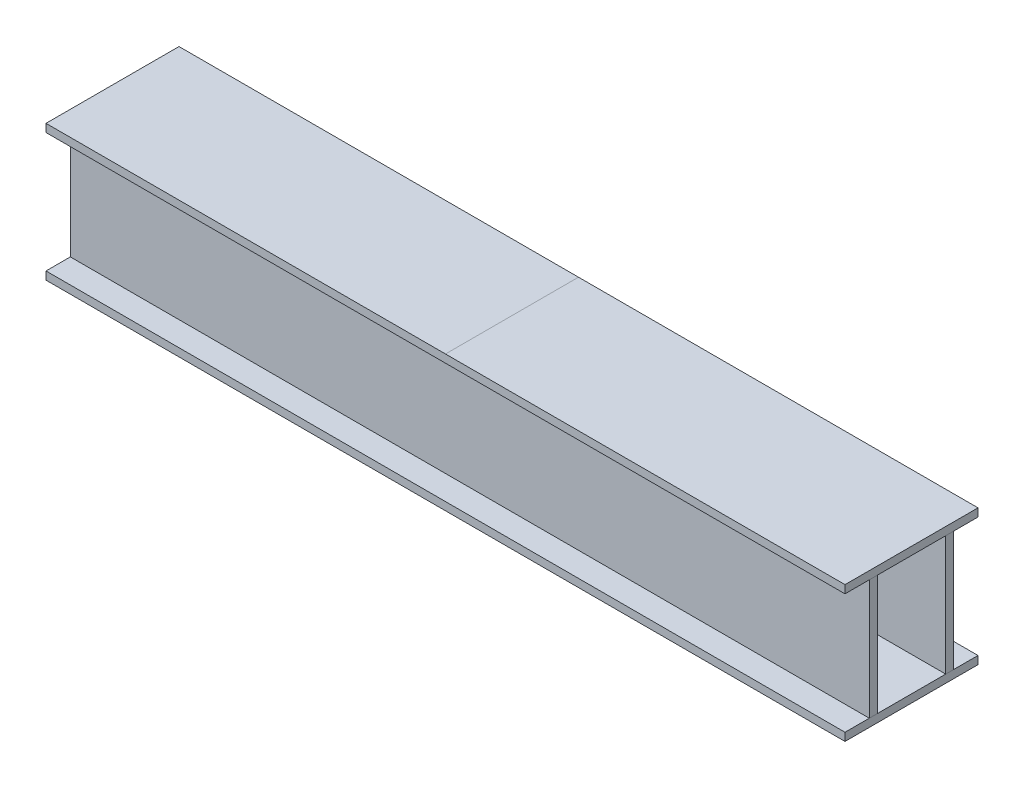
ISO-10303-21;
HEADER;
FILE_DESCRIPTION(('STEP AP214'),'2;1');
FILE_NAME('part.step','',(''),(''),'','','');
FILE_SCHEMA(('AUTOMOTIVE_DESIGN { 1 0 10303 214 1 1 1 1 }'));
ENDSEC;
DATA;
#1=APPLICATION_CONTEXT('core data for automotive mechanical design processes');
#2=APPLICATION_PROTOCOL_DEFINITION('international standard','automotive_design',2000,#1);
#3=PRODUCT_CONTEXT('',#1,'mechanical');
#4=PRODUCT('Part','Part','',(#3));
#5=PRODUCT_RELATED_PRODUCT_CATEGORY('part','',(#4));
#6=PRODUCT_DEFINITION_FORMATION('','',#4);
#7=PRODUCT_DEFINITION_CONTEXT('part definition',#1,'design');
#8=PRODUCT_DEFINITION('design','',#6,#7);
#9=PRODUCT_DEFINITION_SHAPE('','',#8);
#10=(LENGTH_UNIT() NAMED_UNIT(*) SI_UNIT(.MILLI.,.METRE.));
#11=(NAMED_UNIT(*) PLANE_ANGLE_UNIT() SI_UNIT($,.RADIAN.));
#12=(NAMED_UNIT(*) SI_UNIT($,.STERADIAN.) SOLID_ANGLE_UNIT());
#13=UNCERTAINTY_MEASURE_WITH_UNIT(LENGTH_MEASURE(1.E-05),#10,'distance_accuracy_value','');
#14=(GEOMETRIC_REPRESENTATION_CONTEXT(3) GLOBAL_UNCERTAINTY_ASSIGNED_CONTEXT((#13)) GLOBAL_UNIT_ASSIGNED_CONTEXT((#10,
#11,#12)) REPRESENTATION_CONTEXT('',''));
#15=CARTESIAN_POINT('',(0.,0.,0.));
#16=DIRECTION('',(0.,0.,1.));
#17=DIRECTION('',(1.,0.,0.));
#18=AXIS2_PLACEMENT_3D('',#15,#16,#17);
#19=CARTESIAN_POINT('',(500.,-75.,0.));
#20=DIRECTION('',(0.,1.,0.));
#21=DIRECTION('',(0.,0.,1.));
#22=AXIS2_PLACEMENT_3D('',#19,#20,#21);
#23=PLANE('',#22);
#24=DIRECTION('',(0.,0.,-1.));
#25=VECTOR('',#24,1.);
#26=CARTESIAN_POINT('',(-500.,-75.,0.));
#27=LINE('',#26,#25);
#28=CARTESIAN_POINT('',(-500.,-75.,-42.7975000000002));
#29=VERTEX_POINT('',#28);
#30=CARTESIAN_POINT('',(-500.,-75.,-52.7975));
#31=VERTEX_POINT('',#30);
#32=EDGE_CURVE('E119',#29,#31,#27,.T.);
#33=ORIENTED_EDGE('',*,*,#32,.T.);
#34=DIRECTION('',(-1.,0.,0.));
#35=VECTOR('',#34,1.);
#36=CARTESIAN_POINT('',(500.,-75.,-52.7975));
#37=LINE('',#36,#35);
#38=CARTESIAN_POINT('',(500.,-75.,-52.7975));
#39=VERTEX_POINT('',#38);
#40=EDGE_CURVE('E12',#39,#31,#37,.T.);
#41=ORIENTED_EDGE('',*,*,#40,.F.);
#42=DIRECTION('',(0.,0.,-1.));
#43=VECTOR('',#42,1.);
#44=CARTESIAN_POINT('',(500.,-75.,0.));
#45=LINE('',#44,#43);
#46=CARTESIAN_POINT('',(500.,-75.,-42.7975000000002));
#47=VERTEX_POINT('',#46);
#48=EDGE_CURVE('E105',#47,#39,#45,.T.);
#49=ORIENTED_EDGE('',*,*,#48,.F.);
#50=DIRECTION('',(-1.,0.,0.));
#51=VECTOR('',#50,1.);
#52=CARTESIAN_POINT('',(500.,-75.,-42.7975000000002));
#53=LINE('',#52,#51);
#54=EDGE_CURVE('E72',#47,#29,#53,.T.);
#55=ORIENTED_EDGE('',*,*,#54,.T.);
#56=EDGE_LOOP('',(#33,#41,#49,#55));
#57=FACE_BOUND('',#56,.T.);
#58=ADVANCED_FACE('F56',(#57),#23,.F.);
#59=CARTESIAN_POINT('',(500.,0.,-52.7975));
#60=DIRECTION('',(0.,0.,1.));
#61=DIRECTION('',(1.,0.,0.));
#62=AXIS2_PLACEMENT_3D('',#59,#60,#61);
#63=PLANE('',#62);
#64=DIRECTION('',(0.,1.,0.));
#65=VECTOR('',#64,1.);
#66=CARTESIAN_POINT('',(-500.,0.,-52.7975));
#67=LINE('',#66,#65);
#68=CARTESIAN_POINT('',(-500.,75.,-52.7975));
#69=VERTEX_POINT('',#68);
#70=EDGE_CURVE('E110',#31,#69,#67,.T.);
#71=ORIENTED_EDGE('',*,*,#70,.T.);
#72=DIRECTION('',(-1.,0.,0.));
#73=VECTOR('',#72,1.);
#74=CARTESIAN_POINT('',(500.,75.,-52.7975));
#75=LINE('',#74,#73);
#76=CARTESIAN_POINT('',(500.,75.,-52.7975));
#77=VERTEX_POINT('',#76);
#78=EDGE_CURVE('E64',#77,#69,#75,.T.);
#79=ORIENTED_EDGE('',*,*,#78,.F.);
#80=DIRECTION('',(0.,1.,0.));
#81=VECTOR('',#80,1.);
#82=CARTESIAN_POINT('',(500.,0.,-52.7975));
#83=LINE('',#82,#81);
#84=EDGE_CURVE('E97',#39,#77,#83,.T.);
#85=ORIENTED_EDGE('',*,*,#84,.F.);
#86=ORIENTED_EDGE('',*,*,#40,.T.);
#87=EDGE_LOOP('',(#71,#79,#85,#86));
#88=FACE_BOUND('',#87,.T.);
#89=ADVANCED_FACE('F109',(#88),#63,.F.);
#90=CARTESIAN_POINT('',(500.,75.,0.));
#91=DIRECTION('',(0.,1.,0.));
#92=DIRECTION('',(0.,0.,1.));
#93=AXIS2_PLACEMENT_3D('',#90,#91,#92);
#94=PLANE('',#93);
#95=DIRECTION('',(0.,0.,-1.));
#96=VECTOR('',#95,1.);
#97=CARTESIAN_POINT('',(-500.,75.,0.));
#98=LINE('',#97,#96);
#99=CARTESIAN_POINT('',(-500.,75.,-42.7975000000002));
#100=VERTEX_POINT('',#99);
#101=EDGE_CURVE('E122',#100,#69,#98,.T.);
#102=ORIENTED_EDGE('',*,*,#101,.F.);
#103=DIRECTION('',(-1.,0.,0.));
#104=VECTOR('',#103,1.);
#105=CARTESIAN_POINT('',(500.,75.,-42.7975000000002));
#106=LINE('',#105,#104);
#107=CARTESIAN_POINT('',(500.,75.,-42.7975000000002));
#108=VERTEX_POINT('',#107);
#109=EDGE_CURVE('E86',#108,#100,#106,.T.);
#110=ORIENTED_EDGE('',*,*,#109,.F.);
#111=DIRECTION('',(0.,0.,-1.));
#112=VECTOR('',#111,1.);
#113=CARTESIAN_POINT('',(500.,75.,0.));
#114=LINE('',#113,#112);
#115=EDGE_CURVE('E104',#108,#77,#114,.T.);
#116=ORIENTED_EDGE('',*,*,#115,.T.);
#117=ORIENTED_EDGE('',*,*,#78,.T.);
#118=EDGE_LOOP('',(#102,#110,#116,#117));
#119=FACE_BOUND('',#118,.T.);
#120=ADVANCED_FACE('F113',(#119),#94,.T.);
#121=CARTESIAN_POINT('',(500.,0.,-42.7975000000002));
#122=DIRECTION('',(0.,0.,1.));
#123=DIRECTION('',(1.,0.,0.));
#124=AXIS2_PLACEMENT_3D('',#121,#122,#123);
#125=PLANE('',#124);
#126=DIRECTION('',(0.,1.,0.));
#127=VECTOR('',#126,1.);
#128=CARTESIAN_POINT('',(-500.,0.,-42.7975000000002));
#129=LINE('',#128,#127);
#130=EDGE_CURVE('E124',#29,#100,#129,.T.);
#131=ORIENTED_EDGE('',*,*,#130,.F.);
#132=ORIENTED_EDGE('',*,*,#54,.F.);
#133=DIRECTION('',(0.,1.,0.));
#134=VECTOR('',#133,1.);
#135=CARTESIAN_POINT('',(500.,0.,-42.7975000000002));
#136=LINE('',#135,#134);
#137=EDGE_CURVE('E114',#47,#108,#136,.T.);
#138=ORIENTED_EDGE('',*,*,#137,.T.);
#139=ORIENTED_EDGE('',*,*,#109,.T.);
#140=EDGE_LOOP('',(#131,#132,#138,#139));
#141=FACE_BOUND('',#140,.T.);
#142=ADVANCED_FACE('F130',(#141),#125,.T.);
#143=CARTESIAN_POINT('',(500.,0.,0.));
#144=DIRECTION('',(1.,0.,0.));
#145=DIRECTION('',(0.,0.,-1.));
#146=AXIS2_PLACEMENT_3D('',#143,#144,#145);
#147=PLANE('',#146);
#148=ORIENTED_EDGE('',*,*,#48,.T.);
#149=ORIENTED_EDGE('',*,*,#84,.T.);
#150=ORIENTED_EDGE('',*,*,#115,.F.);
#151=ORIENTED_EDGE('',*,*,#137,.F.);
#152=EDGE_LOOP('',(#148,#149,#150,#151));
#153=FACE_BOUND('',#152,.T.);
#154=ADVANCED_FACE('F101',(#153),#147,.T.);
#155=CARTESIAN_POINT('',(-500.,0.,0.));
#156=DIRECTION('',(1.,0.,0.));
#157=DIRECTION('',(0.,0.,-1.));
#158=AXIS2_PLACEMENT_3D('',#155,#156,#157);
#159=PLANE('',#158);
#160=ORIENTED_EDGE('',*,*,#32,.F.);
#161=ORIENTED_EDGE('',*,*,#130,.T.);
#162=ORIENTED_EDGE('',*,*,#101,.T.);
#163=ORIENTED_EDGE('',*,*,#70,.F.);
#164=EDGE_LOOP('',(#160,#161,#162,#163));
#165=FACE_BOUND('',#164,.T.);
#166=ADVANCED_FACE('F129',(#165),#159,.F.);
#167=CLOSED_SHELL('',(#58,#89,#120,#142,#154,#166));
#168=MANIFOLD_SOLID_BREP('B2',#167);
#169=CARTESIAN_POINT('',(500.,-75.0000000000001,1.0408340855861E-13));
#170=DIRECTION('',(0.,1.,0.));
#171=DIRECTION('',(0.,0.,1.));
#172=AXIS2_PLACEMENT_3D('',#169,#170,#171);
#173=PLANE('',#172);
#174=DIRECTION('',(0.,0.,-1.));
#175=VECTOR('',#174,1.);
#176=CARTESIAN_POINT('',(-500.,-75.0000000000001,1.0408340855861E-13));
#177=LINE('',#176,#175);
#178=CARTESIAN_POINT('',(-500.,-75.,52.7975));
#179=VERTEX_POINT('',#178);
#180=CARTESIAN_POINT('',(-500.,-75.,42.7975000000002));
#181=VERTEX_POINT('',#180);
#182=EDGE_CURVE('E259',#179,#181,#177,.T.);
#183=ORIENTED_EDGE('',*,*,#182,.T.);
#184=DIRECTION('',(-1.,0.,0.));
#185=VECTOR('',#184,1.);
#186=CARTESIAN_POINT('',(500.,-75.,42.7975000000002));
#187=LINE('',#186,#185);
#188=CARTESIAN_POINT('',(500.,-75.,42.7975000000002));
#189=VERTEX_POINT('',#188);
#190=EDGE_CURVE('E54',#189,#181,#187,.T.);
#191=ORIENTED_EDGE('',*,*,#190,.F.);
#192=DIRECTION('',(0.,0.,-1.));
#193=VECTOR('',#192,1.);
#194=CARTESIAN_POINT('',(500.,-75.0000000000001,1.0408340855861E-13));
#195=LINE('',#194,#193);
#196=CARTESIAN_POINT('',(500.,-75.,52.7975));
#197=VERTEX_POINT('',#196);
#198=EDGE_CURVE('E245',#197,#189,#195,.T.);
#199=ORIENTED_EDGE('',*,*,#198,.F.);
#200=DIRECTION('',(-1.,0.,0.));
#201=VECTOR('',#200,1.);
#202=CARTESIAN_POINT('',(500.,-75.,52.7975));
#203=LINE('',#202,#201);
#204=EDGE_CURVE('E212',#197,#179,#203,.T.);
#205=ORIENTED_EDGE('',*,*,#204,.T.);
#206=EDGE_LOOP('',(#183,#191,#199,#205));
#207=FACE_BOUND('',#206,.T.);
#208=ADVANCED_FACE('F196',(#207),#173,.F.);
#209=CARTESIAN_POINT('',(500.,0.,42.7975000000002));
#210=DIRECTION('',(0.,0.,1.));
#211=DIRECTION('',(1.,0.,0.));
#212=AXIS2_PLACEMENT_3D('',#209,#210,#211);
#213=PLANE('',#212);
#214=DIRECTION('',(0.,1.,0.));
#215=VECTOR('',#214,1.);
#216=CARTESIAN_POINT('',(-500.,0.,42.7975000000002));
#217=LINE('',#216,#215);
#218=CARTESIAN_POINT('',(-500.,75.,42.7975000000002));
#219=VERTEX_POINT('',#218);
#220=EDGE_CURVE('E250',#181,#219,#217,.T.);
#221=ORIENTED_EDGE('',*,*,#220,.T.);
#222=DIRECTION('',(-1.,0.,0.));
#223=VECTOR('',#222,1.);
#224=CARTESIAN_POINT('',(500.,75.,42.7975000000002));
#225=LINE('',#224,#223);
#226=CARTESIAN_POINT('',(500.,75.,42.7975000000002));
#227=VERTEX_POINT('',#226);
#228=EDGE_CURVE('E204',#227,#219,#225,.T.);
#229=ORIENTED_EDGE('',*,*,#228,.F.);
#230=DIRECTION('',(0.,1.,0.));
#231=VECTOR('',#230,1.);
#232=CARTESIAN_POINT('',(500.,0.,42.7975000000002));
#233=LINE('',#232,#231);
#234=EDGE_CURVE('E237',#189,#227,#233,.T.);
#235=ORIENTED_EDGE('',*,*,#234,.F.);
#236=ORIENTED_EDGE('',*,*,#190,.T.);
#237=EDGE_LOOP('',(#221,#229,#235,#236));
#238=FACE_BOUND('',#237,.T.);
#239=ADVANCED_FACE('F249',(#238),#213,.F.);
#240=CARTESIAN_POINT('',(500.,75.,0.));
#241=DIRECTION('',(0.,1.,0.));
#242=DIRECTION('',(0.,0.,1.));
#243=AXIS2_PLACEMENT_3D('',#240,#241,#242);
#244=PLANE('',#243);
#245=DIRECTION('',(0.,0.,-1.));
#246=VECTOR('',#245,1.);
#247=CARTESIAN_POINT('',(-500.,75.,0.));
#248=LINE('',#247,#246);
#249=CARTESIAN_POINT('',(-500.,75.,52.7975));
#250=VERTEX_POINT('',#249);
#251=EDGE_CURVE('E262',#250,#219,#248,.T.);
#252=ORIENTED_EDGE('',*,*,#251,.F.);
#253=DIRECTION('',(-1.,0.,0.));
#254=VECTOR('',#253,1.);
#255=CARTESIAN_POINT('',(500.,75.,52.7975));
#256=LINE('',#255,#254);
#257=CARTESIAN_POINT('',(500.,75.,52.7975));
#258=VERTEX_POINT('',#257);
#259=EDGE_CURVE('E226',#258,#250,#256,.T.);
#260=ORIENTED_EDGE('',*,*,#259,.F.);
#261=DIRECTION('',(0.,0.,-1.));
#262=VECTOR('',#261,1.);
#263=CARTESIAN_POINT('',(500.,75.,0.));
#264=LINE('',#263,#262);
#265=EDGE_CURVE('E244',#258,#227,#264,.T.);
#266=ORIENTED_EDGE('',*,*,#265,.T.);
#267=ORIENTED_EDGE('',*,*,#228,.T.);
#268=EDGE_LOOP('',(#252,#260,#266,#267));
#269=FACE_BOUND('',#268,.T.);
#270=ADVANCED_FACE('F253',(#269),#244,.T.);
#271=CARTESIAN_POINT('',(500.,0.,52.7975));
#272=DIRECTION('',(0.,0.,1.));
#273=DIRECTION('',(1.,0.,0.));
#274=AXIS2_PLACEMENT_3D('',#271,#272,#273);
#275=PLANE('',#274);
#276=DIRECTION('',(0.,1.,0.));
#277=VECTOR('',#276,1.);
#278=CARTESIAN_POINT('',(-500.,0.,52.7975));
#279=LINE('',#278,#277);
#280=EDGE_CURVE('E263',#179,#250,#279,.T.);
#281=ORIENTED_EDGE('',*,*,#280,.F.);
#282=ORIENTED_EDGE('',*,*,#204,.F.);
#283=DIRECTION('',(0.,1.,0.));
#284=VECTOR('',#283,1.);
#285=CARTESIAN_POINT('',(500.,0.,52.7975));
#286=LINE('',#285,#284);
#287=EDGE_CURVE('E254',#197,#258,#286,.T.);
#288=ORIENTED_EDGE('',*,*,#287,.T.);
#289=ORIENTED_EDGE('',*,*,#259,.T.);
#290=EDGE_LOOP('',(#281,#282,#288,#289));
#291=FACE_BOUND('',#290,.T.);
#292=ADVANCED_FACE('F271',(#291),#275,.T.);
#293=CARTESIAN_POINT('',(500.,0.,0.));
#294=DIRECTION('',(1.,0.,0.));
#295=DIRECTION('',(0.,0.,-1.));
#296=AXIS2_PLACEMENT_3D('',#293,#294,#295);
#297=PLANE('',#296);
#298=ORIENTED_EDGE('',*,*,#198,.T.);
#299=ORIENTED_EDGE('',*,*,#234,.T.);
#300=ORIENTED_EDGE('',*,*,#265,.F.);
#301=ORIENTED_EDGE('',*,*,#287,.F.);
#302=EDGE_LOOP('',(#298,#299,#300,#301));
#303=FACE_BOUND('',#302,.T.);
#304=ADVANCED_FACE('F241',(#303),#297,.T.);
#305=CARTESIAN_POINT('',(-500.,0.,0.));
#306=DIRECTION('',(1.,0.,0.));
#307=DIRECTION('',(0.,0.,-1.));
#308=AXIS2_PLACEMENT_3D('',#305,#306,#307);
#309=PLANE('',#308);
#310=ORIENTED_EDGE('',*,*,#182,.F.);
#311=ORIENTED_EDGE('',*,*,#280,.T.);
#312=ORIENTED_EDGE('',*,*,#251,.T.);
#313=ORIENTED_EDGE('',*,*,#220,.F.);
#314=EDGE_LOOP('',(#310,#311,#312,#313));
#315=FACE_BOUND('',#314,.T.);
#316=ADVANCED_FACE('F270',(#315),#309,.F.);
#317=CLOSED_SHELL('',(#208,#239,#270,#292,#304,#316));
#318=MANIFOLD_SOLID_BREP('B6',#317);
#319=CARTESIAN_POINT('',(500.,-85.,0.));
#320=DIRECTION('',(0.,1.,0.));
#321=DIRECTION('',(0.,0.,1.));
#322=AXIS2_PLACEMENT_3D('',#319,#320,#321);
#323=PLANE('',#322);
#324=DIRECTION('',(0.,0.,-1.));
#325=VECTOR('',#324,1.);
#326=CARTESIAN_POINT('',(-500.,-85.,0.));
#327=LINE('',#326,#325);
#328=CARTESIAN_POINT('',(-500.,-85.,83.228));
#329=VERTEX_POINT('',#328);
#330=CARTESIAN_POINT('',(-500.,-85.,-83.228));
#331=VERTEX_POINT('',#330);
#332=EDGE_CURVE('E399',#329,#331,#327,.T.);
#333=ORIENTED_EDGE('',*,*,#332,.T.);
#334=DIRECTION('',(-1.,0.,0.));
#335=VECTOR('',#334,1.);
#336=CARTESIAN_POINT('',(500.,-85.,-83.228));
#337=LINE('',#336,#335);
#338=CARTESIAN_POINT('',(500.,-85.,-83.228));
#339=VERTEX_POINT('',#338);
#340=EDGE_CURVE('E194',#339,#331,#337,.T.);
#341=ORIENTED_EDGE('',*,*,#340,.F.);
#342=DIRECTION('',(0.,0.,-1.));
#343=VECTOR('',#342,1.);
#344=CARTESIAN_POINT('',(500.,-85.,0.));
#345=LINE('',#344,#343);
#346=CARTESIAN_POINT('',(500.,-85.,83.228));
#347=VERTEX_POINT('',#346);
#348=EDGE_CURVE('E385',#347,#339,#345,.T.);
#349=ORIENTED_EDGE('',*,*,#348,.F.);
#350=DIRECTION('',(-1.,0.,0.));
#351=VECTOR('',#350,1.);
#352=CARTESIAN_POINT('',(500.,-85.,83.228));
#353=LINE('',#352,#351);
#354=EDGE_CURVE('E352',#347,#329,#353,.T.);
#355=ORIENTED_EDGE('',*,*,#354,.T.);
#356=EDGE_LOOP('',(#333,#341,#349,#355));
#357=FACE_BOUND('',#356,.T.);
#358=ADVANCED_FACE('F336',(#357),#323,.F.);
#359=CARTESIAN_POINT('',(500.,0.,-83.228));
#360=DIRECTION('',(0.,0.,1.));
#361=DIRECTION('',(1.,0.,0.));
#362=AXIS2_PLACEMENT_3D('',#359,#360,#361);
#363=PLANE('',#362);
#364=DIRECTION('',(0.,1.,0.));
#365=VECTOR('',#364,1.);
#366=CARTESIAN_POINT('',(-500.,0.,-83.228));
#367=LINE('',#366,#365);
#368=CARTESIAN_POINT('',(-500.,-75.,-83.228));
#369=VERTEX_POINT('',#368);
#370=EDGE_CURVE('E390',#331,#369,#367,.T.);
#371=ORIENTED_EDGE('',*,*,#370,.T.);
#372=DIRECTION('',(-1.,0.,0.));
#373=VECTOR('',#372,1.);
#374=CARTESIAN_POINT('',(500.,-75.,-83.228));
#375=LINE('',#374,#373);
#376=CARTESIAN_POINT('',(500.,-75.,-83.228));
#377=VERTEX_POINT('',#376);
#378=EDGE_CURVE('E344',#377,#369,#375,.T.);
#379=ORIENTED_EDGE('',*,*,#378,.F.);
#380=DIRECTION('',(0.,1.,0.));
#381=VECTOR('',#380,1.);
#382=CARTESIAN_POINT('',(500.,0.,-83.228));
#383=LINE('',#382,#381);
#384=EDGE_CURVE('E377',#339,#377,#383,.T.);
#385=ORIENTED_EDGE('',*,*,#384,.F.);
#386=ORIENTED_EDGE('',*,*,#340,.T.);
#387=EDGE_LOOP('',(#371,#379,#385,#386));
#388=FACE_BOUND('',#387,.T.);
#389=ADVANCED_FACE('F389',(#388),#363,.F.);
#390=CARTESIAN_POINT('',(500.,-75.,0.));
#391=DIRECTION('',(0.,1.,0.));
#392=DIRECTION('',(0.,0.,1.));
#393=AXIS2_PLACEMENT_3D('',#390,#391,#392);
#394=PLANE('',#393);
#395=DIRECTION('',(0.,0.,-1.));
#396=VECTOR('',#395,1.);
#397=CARTESIAN_POINT('',(-500.,-75.,0.));
#398=LINE('',#397,#396);
#399=CARTESIAN_POINT('',(-500.,-75.,83.228));
#400=VERTEX_POINT('',#399);
#401=EDGE_CURVE('E402',#400,#369,#398,.T.);
#402=ORIENTED_EDGE('',*,*,#401,.F.);
#403=DIRECTION('',(-1.,0.,0.));
#404=VECTOR('',#403,1.);
#405=CARTESIAN_POINT('',(500.,-75.,83.228));
#406=LINE('',#405,#404);
#407=CARTESIAN_POINT('',(500.,-75.,83.228));
#408=VERTEX_POINT('',#407);
#409=EDGE_CURVE('E366',#408,#400,#406,.T.);
#410=ORIENTED_EDGE('',*,*,#409,.F.);
#411=DIRECTION('',(0.,0.,-1.));
#412=VECTOR('',#411,1.);
#413=CARTESIAN_POINT('',(500.,-75.,0.));
#414=LINE('',#413,#412);
#415=EDGE_CURVE('E384',#408,#377,#414,.T.);
#416=ORIENTED_EDGE('',*,*,#415,.T.);
#417=ORIENTED_EDGE('',*,*,#378,.T.);
#418=EDGE_LOOP('',(#402,#410,#416,#417));
#419=FACE_BOUND('',#418,.T.);
#420=ADVANCED_FACE('F393',(#419),#394,.T.);
#421=CARTESIAN_POINT('',(500.,0.,83.228));
#422=DIRECTION('',(0.,0.,1.));
#423=DIRECTION('',(1.,0.,0.));
#424=AXIS2_PLACEMENT_3D('',#421,#422,#423);
#425=PLANE('',#424);
#426=DIRECTION('',(0.,1.,0.));
#427=VECTOR('',#426,1.);
#428=CARTESIAN_POINT('',(-500.,0.,83.228));
#429=LINE('',#428,#427);
#430=EDGE_CURVE('E404',#329,#400,#429,.T.);
#431=ORIENTED_EDGE('',*,*,#430,.F.);
#432=ORIENTED_EDGE('',*,*,#354,.F.);
#433=DIRECTION('',(0.,1.,0.));
#434=VECTOR('',#433,1.);
#435=CARTESIAN_POINT('',(500.,0.,83.228));
#436=LINE('',#435,#434);
#437=EDGE_CURVE('E394',#347,#408,#436,.T.);
#438=ORIENTED_EDGE('',*,*,#437,.T.);
#439=ORIENTED_EDGE('',*,*,#409,.T.);
#440=EDGE_LOOP('',(#431,#432,#438,#439));
#441=FACE_BOUND('',#440,.T.);
#442=ADVANCED_FACE('F410',(#441),#425,.T.);
#443=CARTESIAN_POINT('',(500.,0.,0.));
#444=DIRECTION('',(1.,0.,0.));
#445=DIRECTION('',(0.,0.,-1.));
#446=AXIS2_PLACEMENT_3D('',#443,#444,#445);
#447=PLANE('',#446);
#448=ORIENTED_EDGE('',*,*,#348,.T.);
#449=ORIENTED_EDGE('',*,*,#384,.T.);
#450=ORIENTED_EDGE('',*,*,#415,.F.);
#451=ORIENTED_EDGE('',*,*,#437,.F.);
#452=EDGE_LOOP('',(#448,#449,#450,#451));
#453=FACE_BOUND('',#452,.T.);
#454=ADVANCED_FACE('F381',(#453),#447,.T.);
#455=CARTESIAN_POINT('',(-500.,0.,0.));
#456=DIRECTION('',(1.,0.,0.));
#457=DIRECTION('',(0.,0.,-1.));
#458=AXIS2_PLACEMENT_3D('',#455,#456,#457);
#459=PLANE('',#458);
#460=ORIENTED_EDGE('',*,*,#332,.F.);
#461=ORIENTED_EDGE('',*,*,#430,.T.);
#462=ORIENTED_EDGE('',*,*,#401,.T.);
#463=ORIENTED_EDGE('',*,*,#370,.F.);
#464=EDGE_LOOP('',(#460,#461,#462,#463));
#465=FACE_BOUND('',#464,.T.);
#466=ADVANCED_FACE('F409',(#465),#459,.F.);
#467=CLOSED_SHELL('',(#358,#389,#420,#442,#454,#466));
#468=MANIFOLD_SOLID_BREP('B48',#467);
#469=CARTESIAN_POINT('',(500.,85.,0.));
#470=DIRECTION('',(0.,1.,0.));
#471=DIRECTION('',(0.,0.,1.));
#472=AXIS2_PLACEMENT_3D('',#469,#470,#471);
#473=PLANE('',#472);
#474=DIRECTION('',(-1.,0.,0.));
#475=VECTOR('',#474,1.);
#476=CARTESIAN_POINT('',(500.,85.,83.228));
#477=LINE('',#476,#475);
#478=CARTESIAN_POINT('',(0.,85.,83.228));
#479=VERTEX_POINT('',#478);
#480=CARTESIAN_POINT('',(-500.,85.,83.228));
#481=VERTEX_POINT('',#480);
#482=EDGE_CURVE('E548',#479,#481,#477,.T.);
#483=ORIENTED_EDGE('',*,*,#482,.F.);
#484=DIRECTION('',(0.,0.,-1.));
#485=VECTOR('',#484,1.);
#486=CARTESIAN_POINT('',(0.,85.,0.));
#487=LINE('',#486,#485);
#488=CARTESIAN_POINT('',(0.,85.,-83.228));
#489=VERTEX_POINT('',#488);
#490=EDGE_CURVE('E334',#479,#489,#487,.T.);
#491=ORIENTED_EDGE('',*,*,#490,.T.);
#492=DIRECTION('',(-1.,0.,0.));
#493=VECTOR('',#492,1.);
#494=CARTESIAN_POINT('',(500.,85.,-83.228));
#495=LINE('',#494,#493);
#496=CARTESIAN_POINT('',(-500.,85.,-83.228));
#497=VERTEX_POINT('',#496);
#498=EDGE_CURVE('E513',#489,#497,#495,.T.);
#499=ORIENTED_EDGE('',*,*,#498,.T.);
#500=DIRECTION('',(0.,0.,-1.));
#501=VECTOR('',#500,1.);
#502=CARTESIAN_POINT('',(-500.,85.,0.));
#503=LINE('',#502,#501);
#504=EDGE_CURVE('E537',#481,#497,#503,.T.);
#505=ORIENTED_EDGE('',*,*,#504,.F.);
#506=EDGE_LOOP('',(#483,#491,#499,#505));
#507=FACE_BOUND('',#506,.T.);
#508=ADVANCED_FACE('F466',(#507),#473,.T.);
#509=CARTESIAN_POINT('',(500.,0.,-83.228));
#510=DIRECTION('',(0.,0.,-1.));
#511=DIRECTION('',(-1.,0.,0.));
#512=AXIS2_PLACEMENT_3D('',#509,#510,#511);
#513=PLANE('',#512);
#514=DIRECTION('',(0.,-1.,0.));
#515=VECTOR('',#514,1.);
#516=CARTESIAN_POINT('',(-500.,0.,-83.228));
#517=LINE('',#516,#515);
#518=CARTESIAN_POINT('',(-500.,75.,-83.228));
#519=VERTEX_POINT('',#518);
#520=EDGE_CURVE('E534',#497,#519,#517,.T.);
#521=ORIENTED_EDGE('',*,*,#520,.F.);
#522=ORIENTED_EDGE('',*,*,#498,.F.);
#523=CARTESIAN_POINT('',(500.,85.,-83.228));
#524=VERTEX_POINT('',#523);
#525=EDGE_CURVE('E476',#524,#489,#495,.T.);
#526=ORIENTED_EDGE('',*,*,#525,.F.);
#527=DIRECTION('',(0.,-1.,0.));
#528=VECTOR('',#527,1.);
#529=CARTESIAN_POINT('',(500.,0.,-83.228));
#530=LINE('',#529,#528);
#531=CARTESIAN_POINT('',(500.,75.,-83.228));
#532=VERTEX_POINT('',#531);
#533=EDGE_CURVE('E512',#524,#532,#530,.T.);
#534=ORIENTED_EDGE('',*,*,#533,.T.);
#535=DIRECTION('',(-1.,0.,0.));
#536=VECTOR('',#535,1.);
#537=CARTESIAN_POINT('',(500.,75.,-83.228));
#538=LINE('',#537,#536);
#539=EDGE_CURVE('E533',#532,#519,#538,.T.);
#540=ORIENTED_EDGE('',*,*,#539,.T.);
#541=EDGE_LOOP('',(#521,#522,#526,#534,#540));
#542=FACE_BOUND('',#541,.T.);
#543=ADVANCED_FACE('F468',(#542),#513,.T.);
#544=ORIENTED_EDGE('',*,*,#490,.F.);
#545=CARTESIAN_POINT('',(500.,85.,83.228));
#546=VERTEX_POINT('',#545);
#547=EDGE_CURVE('E526',#546,#479,#477,.T.);
#548=ORIENTED_EDGE('',*,*,#547,.F.);
#549=DIRECTION('',(0.,0.,-1.));
#550=VECTOR('',#549,1.);
#551=CARTESIAN_POINT('',(500.,85.,0.));
#552=LINE('',#551,#550);
#553=EDGE_CURVE('E518',#546,#524,#552,.T.);
#554=ORIENTED_EDGE('',*,*,#553,.T.);
#555=ORIENTED_EDGE('',*,*,#525,.T.);
#556=EDGE_LOOP('',(#544,#548,#554,#555));
#557=FACE_BOUND('',#556,.T.);
#558=ADVANCED_FACE('F524',(#557),#473,.T.);
#559=CARTESIAN_POINT('',(500.,0.,83.228));
#560=DIRECTION('',(0.,0.,-1.));
#561=DIRECTION('',(-1.,0.,0.));
#562=AXIS2_PLACEMENT_3D('',#559,#560,#561);
#563=PLANE('',#562);
#564=DIRECTION('',(0.,-1.,0.));
#565=VECTOR('',#564,1.);
#566=CARTESIAN_POINT('',(-500.,0.,83.228));
#567=LINE('',#566,#565);
#568=CARTESIAN_POINT('',(-500.,75.,83.228));
#569=VERTEX_POINT('',#568);
#570=EDGE_CURVE('E540',#481,#569,#567,.T.);
#571=ORIENTED_EDGE('',*,*,#570,.T.);
#572=DIRECTION('',(-1.,0.,0.));
#573=VECTOR('',#572,1.);
#574=CARTESIAN_POINT('',(500.,75.,83.228));
#575=LINE('',#574,#573);
#576=CARTESIAN_POINT('',(500.,75.,83.228));
#577=VERTEX_POINT('',#576);
#578=EDGE_CURVE('E545',#577,#569,#575,.T.);
#579=ORIENTED_EDGE('',*,*,#578,.F.);
#580=DIRECTION('',(0.,-1.,0.));
#581=VECTOR('',#580,1.);
#582=CARTESIAN_POINT('',(500.,0.,83.228));
#583=LINE('',#582,#581);
#584=EDGE_CURVE('E528',#546,#577,#583,.T.);
#585=ORIENTED_EDGE('',*,*,#584,.F.);
#586=ORIENTED_EDGE('',*,*,#547,.T.);
#587=ORIENTED_EDGE('',*,*,#482,.T.);
#588=EDGE_LOOP('',(#571,#579,#585,#586,#587));
#589=FACE_BOUND('',#588,.T.);
#590=ADVANCED_FACE('F551',(#589),#563,.F.);
#591=CARTESIAN_POINT('',(500.,75.,0.));
#592=DIRECTION('',(0.,1.,0.));
#593=DIRECTION('',(0.,0.,1.));
#594=AXIS2_PLACEMENT_3D('',#591,#592,#593);
#595=PLANE('',#594);
#596=DIRECTION('',(0.,0.,-1.));
#597=VECTOR('',#596,1.);
#598=CARTESIAN_POINT('',(-500.,75.,0.));
#599=LINE('',#598,#597);
#600=EDGE_CURVE('E522',#569,#519,#599,.T.);
#601=ORIENTED_EDGE('',*,*,#600,.T.);
#602=ORIENTED_EDGE('',*,*,#539,.F.);
#603=DIRECTION('',(0.,0.,-1.));
#604=VECTOR('',#603,1.);
#605=CARTESIAN_POINT('',(500.,75.,0.));
#606=LINE('',#605,#604);
#607=EDGE_CURVE('E520',#577,#532,#606,.T.);
#608=ORIENTED_EDGE('',*,*,#607,.F.);
#609=ORIENTED_EDGE('',*,*,#578,.T.);
#610=EDGE_LOOP('',(#601,#602,#608,#609));
#611=FACE_BOUND('',#610,.T.);
#612=ADVANCED_FACE('F558',(#611),#595,.F.);
#613=CARTESIAN_POINT('',(500.,0.,0.));
#614=DIRECTION('',(1.,0.,0.));
#615=DIRECTION('',(0.,0.,-1.));
#616=AXIS2_PLACEMENT_3D('',#613,#614,#615);
#617=PLANE('',#616);
#618=ORIENTED_EDGE('',*,*,#533,.F.);
#619=ORIENTED_EDGE('',*,*,#553,.F.);
#620=ORIENTED_EDGE('',*,*,#584,.T.);
#621=ORIENTED_EDGE('',*,*,#607,.T.);
#622=EDGE_LOOP('',(#618,#619,#620,#621));
#623=FACE_BOUND('',#622,.T.);
#624=ADVANCED_FACE('F517',(#623),#617,.T.);
#625=CARTESIAN_POINT('',(-500.,0.,0.));
#626=DIRECTION('',(1.,0.,0.));
#627=DIRECTION('',(0.,0.,-1.));
#628=AXIS2_PLACEMENT_3D('',#625,#626,#627);
#629=PLANE('',#628);
#630=ORIENTED_EDGE('',*,*,#520,.T.);
#631=ORIENTED_EDGE('',*,*,#600,.F.);
#632=ORIENTED_EDGE('',*,*,#570,.F.);
#633=ORIENTED_EDGE('',*,*,#504,.T.);
#634=EDGE_LOOP('',(#630,#631,#632,#633));
#635=FACE_BOUND('',#634,.T.);
#636=ADVANCED_FACE('F556',(#635),#629,.F.);
#637=CLOSED_SHELL('',(#508,#543,#558,#590,#612,#624,#636));
#638=MANIFOLD_SOLID_BREP('B188',#637);
#639=ADVANCED_BREP_SHAPE_REPRESENTATION('',(#18,#168,#318,#468,#638),#14);
#640=SHAPE_DEFINITION_REPRESENTATION(#9,#639);
ENDSEC;
END-ISO-10303-21;
